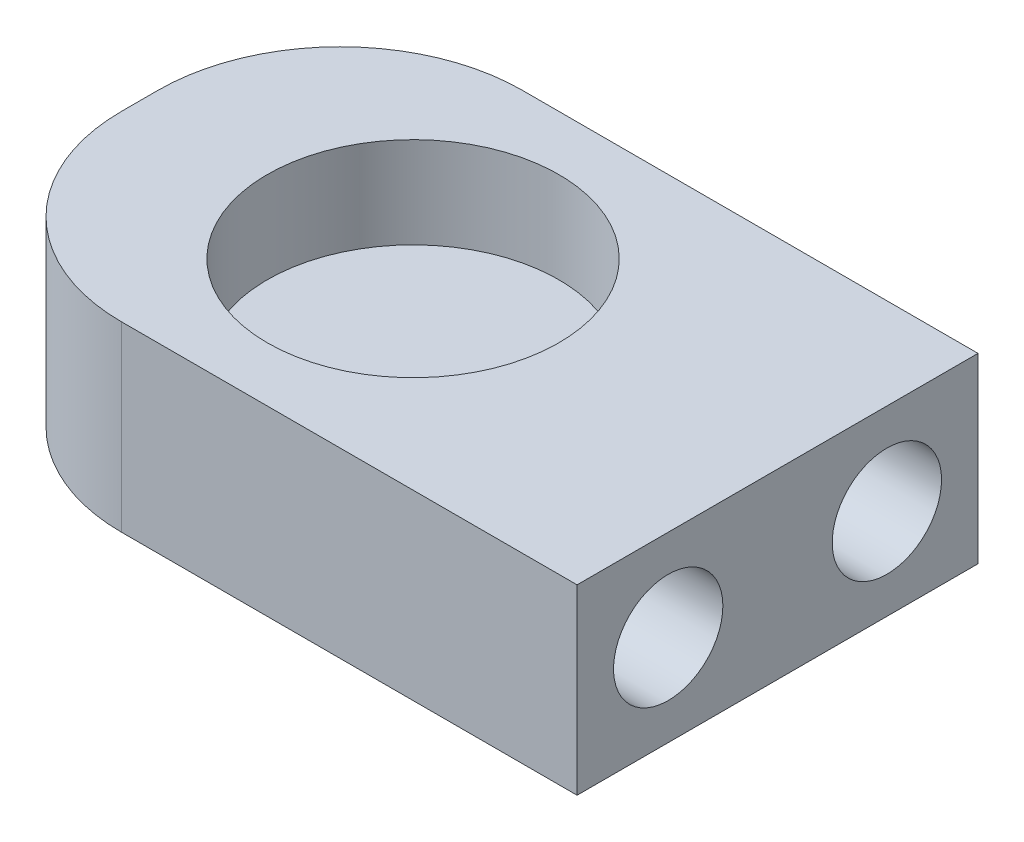
ISO-10303-21;
HEADER;
FILE_DESCRIPTION(('STEP AP214'),'2;1');
FILE_NAME('part.step','',(''),(''),'','','');
FILE_SCHEMA(('AUTOMOTIVE_DESIGN { 1 0 10303 214 1 1 1 1 }'));
ENDSEC;
DATA;
#1=APPLICATION_CONTEXT('core data for automotive mechanical design processes');
#2=APPLICATION_PROTOCOL_DEFINITION('international standard','automotive_design',2000,#1);
#3=PRODUCT_CONTEXT('',#1,'mechanical');
#4=PRODUCT('Part','Part','',(#3));
#5=PRODUCT_RELATED_PRODUCT_CATEGORY('part','',(#4));
#6=PRODUCT_DEFINITION_FORMATION('','',#4);
#7=PRODUCT_DEFINITION_CONTEXT('part definition',#1,'design');
#8=PRODUCT_DEFINITION('design','',#6,#7);
#9=PRODUCT_DEFINITION_SHAPE('','',#8);
#10=(LENGTH_UNIT() NAMED_UNIT(*) SI_UNIT(.MILLI.,.METRE.));
#11=(NAMED_UNIT(*) PLANE_ANGLE_UNIT() SI_UNIT($,.RADIAN.));
#12=(NAMED_UNIT(*) SI_UNIT($,.STERADIAN.) SOLID_ANGLE_UNIT());
#13=UNCERTAINTY_MEASURE_WITH_UNIT(LENGTH_MEASURE(1.E-05),#10,'distance_accuracy_value','');
#14=(GEOMETRIC_REPRESENTATION_CONTEXT(3) GLOBAL_UNCERTAINTY_ASSIGNED_CONTEXT((#13)) GLOBAL_UNIT_ASSIGNED_CONTEXT((#10,
#11,#12)) REPRESENTATION_CONTEXT('',''));
#15=CARTESIAN_POINT('',(0.,0.,0.));
#16=DIRECTION('',(0.,0.,1.));
#17=DIRECTION('',(1.,0.,0.));
#18=AXIS2_PLACEMENT_3D('',#15,#16,#17);
#19=CARTESIAN_POINT('',(17.5,10.,-11.));
#20=DIRECTION('',(-1.,0.,0.));
#21=DIRECTION('',(0.,0.,1.));
#22=AXIS2_PLACEMENT_3D('',#19,#20,#21);
#23=PLANE('',#22);
#24=CARTESIAN_POINT('',(17.5,5.,-6.));
#25=DIRECTION('',(1.,0.,0.));
#26=DIRECTION('',(0.,0.,-1.));
#27=AXIS2_PLACEMENT_3D('',#24,#25,#26);
#28=CIRCLE('',#27,3.);
#29=CARTESIAN_POINT('',(17.5,5.,-9.));
#30=VERTEX_POINT('',#29);
#31=EDGE_CURVE('E234',#30,#30,#28,.T.);
#32=ORIENTED_EDGE('',*,*,#31,.F.);
#33=EDGE_LOOP('',(#32));
#34=FACE_BOUND('',#33,.T.);
#35=CARTESIAN_POINT('',(17.5,5.,6.));
#36=DIRECTION('',(1.,0.,0.));
#37=DIRECTION('',(0.,0.,-1.));
#38=AXIS2_PLACEMENT_3D('',#35,#36,#37);
#39=CIRCLE('',#38,3.);
#40=CARTESIAN_POINT('',(17.5,5.,3.));
#41=VERTEX_POINT('',#40);
#42=EDGE_CURVE('E220',#41,#41,#39,.T.);
#43=ORIENTED_EDGE('',*,*,#42,.F.);
#44=EDGE_LOOP('',(#43));
#45=FACE_BOUND('',#44,.T.);
#46=DIRECTION('',(0.,0.,-1.));
#47=VECTOR('',#46,1.);
#48=CARTESIAN_POINT('',(17.5,0.,-11.));
#49=LINE('',#48,#47);
#50=CARTESIAN_POINT('',(17.5,0.,11.));
#51=VERTEX_POINT('',#50);
#52=CARTESIAN_POINT('',(17.5,0.,-11.));
#53=VERTEX_POINT('',#52);
#54=EDGE_CURVE('E114',#51,#53,#49,.T.);
#55=ORIENTED_EDGE('',*,*,#54,.T.);
#56=DIRECTION('',(0.,-1.,0.));
#57=VECTOR('',#56,1.);
#58=CARTESIAN_POINT('',(17.5,10.,-11.));
#59=LINE('',#58,#57);
#60=CARTESIAN_POINT('',(17.5,10.,-11.));
#61=VERTEX_POINT('',#60);
#62=EDGE_CURVE('E97',#61,#53,#59,.T.);
#63=ORIENTED_EDGE('',*,*,#62,.F.);
#64=DIRECTION('',(0.,0.,-1.));
#65=VECTOR('',#64,1.);
#66=CARTESIAN_POINT('',(17.5,10.,-11.));
#67=LINE('',#66,#65);
#68=CARTESIAN_POINT('',(17.5,10.,11.));
#69=VERTEX_POINT('',#68);
#70=EDGE_CURVE('E102',#69,#61,#67,.T.);
#71=ORIENTED_EDGE('',*,*,#70,.F.);
#72=DIRECTION('',(0.,-1.,0.));
#73=VECTOR('',#72,1.);
#74=CARTESIAN_POINT('',(17.5,10.,11.));
#75=LINE('',#74,#73);
#76=EDGE_CURVE('E117',#69,#51,#75,.T.);
#77=ORIENTED_EDGE('',*,*,#76,.T.);
#78=EDGE_LOOP('',(#55,#63,#71,#77));
#79=FACE_BOUND('',#78,.T.);
#80=ADVANCED_FACE('F39',(#34,#45,#79),#23,.F.);
#81=CARTESIAN_POINT('',(-17.5,10.,-11.));
#82=DIRECTION('',(0.,0.,1.));
#83=DIRECTION('',(1.,0.,0.));
#84=AXIS2_PLACEMENT_3D('',#81,#82,#83);
#85=PLANE('',#84);
#86=DIRECTION('',(-1.,0.,0.));
#87=VECTOR('',#86,1.);
#88=CARTESIAN_POINT('',(-17.5,0.,-11.));
#89=LINE('',#88,#87);
#90=CARTESIAN_POINT('',(-7.5,0.,-11.));
#91=VERTEX_POINT('',#90);
#92=EDGE_CURVE('E152',#53,#91,#89,.T.);
#93=ORIENTED_EDGE('',*,*,#92,.T.);
#94=DIRECTION('',(0.,-1.,0.));
#95=VECTOR('',#94,1.);
#96=CARTESIAN_POINT('',(-7.5,10.,-11.));
#97=LINE('',#96,#95);
#98=CARTESIAN_POINT('',(-7.5,10.,-11.));
#99=VERTEX_POINT('',#98);
#100=EDGE_CURVE('E63',#91,#99,#97,.F.);
#101=ORIENTED_EDGE('',*,*,#100,.T.);
#102=DIRECTION('',(-1.,0.,0.));
#103=VECTOR('',#102,1.);
#104=CARTESIAN_POINT('',(-17.5,10.,-11.));
#105=LINE('',#104,#103);
#106=EDGE_CURVE('E93',#61,#99,#105,.T.);
#107=ORIENTED_EDGE('',*,*,#106,.F.);
#108=ORIENTED_EDGE('',*,*,#62,.T.);
#109=EDGE_LOOP('',(#93,#101,#107,#108));
#110=FACE_BOUND('',#109,.T.);
#111=ADVANCED_FACE('F95',(#110),#85,.F.);
#112=CARTESIAN_POINT('',(-17.5,10.,-11.));
#113=DIRECTION('',(1.,0.,0.));
#114=DIRECTION('',(0.,0.,-1.));
#115=AXIS2_PLACEMENT_3D('',#112,#113,#114);
#116=PLANE('',#115);
#117=DIRECTION('',(0.,0.,1.));
#118=VECTOR('',#117,1.);
#119=CARTESIAN_POINT('',(-17.5,10.,-11.));
#120=LINE('',#119,#118);
#121=CARTESIAN_POINT('',(-17.5,10.,-0.999999999999996));
#122=VERTEX_POINT('',#121);
#123=CARTESIAN_POINT('',(-17.5,10.,1.));
#124=VERTEX_POINT('',#123);
#125=EDGE_CURVE('E101',#122,#124,#120,.T.);
#126=ORIENTED_EDGE('',*,*,#125,.F.);
#127=DIRECTION('',(0.,-1.,0.));
#128=VECTOR('',#127,1.);
#129=CARTESIAN_POINT('',(-17.5,10.,-0.999999999999996));
#130=LINE('',#129,#128);
#131=CARTESIAN_POINT('',(-17.5,0.,-0.999999999999996));
#132=VERTEX_POINT('',#131);
#133=EDGE_CURVE('E121',#122,#132,#130,.T.);
#134=ORIENTED_EDGE('',*,*,#133,.T.);
#135=DIRECTION('',(0.,0.,1.));
#136=VECTOR('',#135,1.);
#137=CARTESIAN_POINT('',(-17.5,0.,-11.));
#138=LINE('',#137,#136);
#139=CARTESIAN_POINT('',(-17.5,0.,1.));
#140=VERTEX_POINT('',#139);
#141=EDGE_CURVE('E153',#132,#140,#138,.T.);
#142=ORIENTED_EDGE('',*,*,#141,.T.);
#143=DIRECTION('',(0.,-1.,0.));
#144=VECTOR('',#143,1.);
#145=CARTESIAN_POINT('',(-17.5,10.,1.));
#146=LINE('',#145,#144);
#147=EDGE_CURVE('E116',#140,#124,#146,.F.);
#148=ORIENTED_EDGE('',*,*,#147,.T.);
#149=EDGE_LOOP('',(#126,#134,#142,#148));
#150=FACE_BOUND('',#149,.T.);
#151=ADVANCED_FACE('F143',(#150),#116,.F.);
#152=CARTESIAN_POINT('',(-17.5,10.,11.));
#153=DIRECTION('',(0.,0.,-1.));
#154=DIRECTION('',(-1.,0.,0.));
#155=AXIS2_PLACEMENT_3D('',#152,#153,#154);
#156=PLANE('',#155);
#157=DIRECTION('',(1.,0.,0.));
#158=VECTOR('',#157,1.);
#159=CARTESIAN_POINT('',(-17.5,10.,11.));
#160=LINE('',#159,#158);
#161=CARTESIAN_POINT('',(-7.5,10.,11.));
#162=VERTEX_POINT('',#161);
#163=EDGE_CURVE('E106',#162,#69,#160,.T.);
#164=ORIENTED_EDGE('',*,*,#163,.F.);
#165=DIRECTION('',(0.,-1.,0.));
#166=VECTOR('',#165,1.);
#167=CARTESIAN_POINT('',(-7.5,10.,11.));
#168=LINE('',#167,#166);
#169=CARTESIAN_POINT('',(-7.5,0.,11.));
#170=VERTEX_POINT('',#169);
#171=EDGE_CURVE('E11',#162,#170,#168,.T.);
#172=ORIENTED_EDGE('',*,*,#171,.T.);
#173=DIRECTION('',(1.,0.,0.));
#174=VECTOR('',#173,1.);
#175=CARTESIAN_POINT('',(-17.5,0.,11.));
#176=LINE('',#175,#174);
#177=EDGE_CURVE('E111',#170,#51,#176,.T.);
#178=ORIENTED_EDGE('',*,*,#177,.T.);
#179=ORIENTED_EDGE('',*,*,#76,.F.);
#180=EDGE_LOOP('',(#164,#172,#178,#179));
#181=FACE_BOUND('',#180,.T.);
#182=ADVANCED_FACE('F165',(#181),#156,.F.);
#183=CARTESIAN_POINT('',(0.,10.,0.));
#184=DIRECTION('',(0.,1.,0.));
#185=DIRECTION('',(0.,0.,1.));
#186=AXIS2_PLACEMENT_3D('',#183,#184,#185);
#187=PLANE('',#186);
#188=CARTESIAN_POINT('',(-2.5,10.,0.));
#189=DIRECTION('',(0.,1.,0.));
#190=DIRECTION('',(0.,0.,1.));
#191=AXIS2_PLACEMENT_3D('',#188,#189,#190);
#192=CIRCLE('',#191,8.);
#193=CARTESIAN_POINT('',(-2.5,10.,8.));
#194=VERTEX_POINT('',#193);
#195=EDGE_CURVE('E221',#194,#194,#192,.T.);
#196=ORIENTED_EDGE('',*,*,#195,.F.);
#197=EDGE_LOOP('',(#196));
#198=FACE_BOUND('',#197,.T.);
#199=ORIENTED_EDGE('',*,*,#106,.T.);
#200=CARTESIAN_POINT('',(-7.5,10.,-0.999999999999997));
#201=DIRECTION('',(0.,1.,0.));
#202=DIRECTION('',(0.,0.,1.));
#203=AXIS2_PLACEMENT_3D('',#200,#201,#202);
#204=CIRCLE('',#203,10.);
#205=EDGE_CURVE('E48',#99,#122,#204,.T.);
#206=ORIENTED_EDGE('',*,*,#205,.T.);
#207=ORIENTED_EDGE('',*,*,#125,.T.);
#208=CARTESIAN_POINT('',(-7.5,10.,1.));
#209=DIRECTION('',(0.,1.,0.));
#210=DIRECTION('',(0.,0.,1.));
#211=AXIS2_PLACEMENT_3D('',#208,#209,#210);
#212=CIRCLE('',#211,10.);
#213=EDGE_CURVE('E55',#124,#162,#212,.T.);
#214=ORIENTED_EDGE('',*,*,#213,.T.);
#215=ORIENTED_EDGE('',*,*,#163,.T.);
#216=ORIENTED_EDGE('',*,*,#70,.T.);
#217=EDGE_LOOP('',(#199,#206,#207,#214,#215,#216));
#218=FACE_BOUND('',#217,.T.);
#219=ADVANCED_FACE('F105',(#198,#218),#187,.T.);
#220=CARTESIAN_POINT('',(0.,0.,0.));
#221=DIRECTION('',(0.,1.,0.));
#222=DIRECTION('',(0.,0.,1.));
#223=AXIS2_PLACEMENT_3D('',#220,#221,#222);
#224=PLANE('',#223);
#225=ORIENTED_EDGE('',*,*,#141,.F.);
#226=CARTESIAN_POINT('',(-7.5,0.,-0.999999999999997));
#227=DIRECTION('',(0.,1.,0.));
#228=DIRECTION('',(0.,0.,1.));
#229=AXIS2_PLACEMENT_3D('',#226,#227,#228);
#230=CIRCLE('',#229,10.);
#231=EDGE_CURVE('E132',#132,#91,#230,.F.);
#232=ORIENTED_EDGE('',*,*,#231,.T.);
#233=ORIENTED_EDGE('',*,*,#92,.F.);
#234=ORIENTED_EDGE('',*,*,#54,.F.);
#235=ORIENTED_EDGE('',*,*,#177,.F.);
#236=CARTESIAN_POINT('',(-7.5,0.,1.));
#237=DIRECTION('',(0.,1.,0.));
#238=DIRECTION('',(0.,0.,1.));
#239=AXIS2_PLACEMENT_3D('',#236,#237,#238);
#240=CIRCLE('',#239,10.);
#241=EDGE_CURVE('E129',#170,#140,#240,.F.);
#242=ORIENTED_EDGE('',*,*,#241,.T.);
#243=EDGE_LOOP('',(#225,#232,#233,#234,#235,#242));
#244=FACE_BOUND('',#243,.T.);
#245=ADVANCED_FACE('F151',(#244),#224,.F.);
#246=CARTESIAN_POINT('',(7.5,5.,6.));
#247=DIRECTION('',(1.,0.,0.));
#248=DIRECTION('',(0.,0.,-1.));
#249=AXIS2_PLACEMENT_3D('',#246,#247,#248);
#250=CYLINDRICAL_SURFACE('',#249,3.);
#251=CARTESIAN_POINT('',(7.5,5.,6.));
#252=DIRECTION('',(1.,0.,0.));
#253=DIRECTION('',(0.,0.,-1.));
#254=AXIS2_PLACEMENT_3D('',#251,#252,#253);
#255=CIRCLE('',#254,3.);
#256=CARTESIAN_POINT('',(7.5,5.,3.));
#257=VERTEX_POINT('',#256);
#258=EDGE_CURVE('E226',#257,#257,#255,.T.);
#259=ORIENTED_EDGE('',*,*,#258,.F.);
#260=EDGE_LOOP('',(#259));
#261=FACE_BOUND('',#260,.T.);
#262=ORIENTED_EDGE('',*,*,#42,.T.);
#263=EDGE_LOOP('',(#262));
#264=FACE_BOUND('',#263,.T.);
#265=ADVANCED_FACE('F189',(#261,#264),#250,.F.);
#266=CARTESIAN_POINT('',(7.5,5.,6.));
#267=DIRECTION('',(1.,0.,0.));
#268=DIRECTION('',(0.,0.,-1.));
#269=AXIS2_PLACEMENT_3D('',#266,#267,#268);
#270=PLANE('',#269);
#271=ORIENTED_EDGE('',*,*,#258,.T.);
#272=EDGE_LOOP('',(#271));
#273=FACE_BOUND('',#272,.T.);
#274=ADVANCED_FACE('F195',(#273),#270,.T.);
#275=CARTESIAN_POINT('',(7.5,5.,-6.));
#276=DIRECTION('',(1.,0.,0.));
#277=DIRECTION('',(0.,0.,-1.));
#278=AXIS2_PLACEMENT_3D('',#275,#276,#277);
#279=CYLINDRICAL_SURFACE('',#278,3.);
#280=CARTESIAN_POINT('',(7.5,5.,-6.));
#281=DIRECTION('',(1.,0.,0.));
#282=DIRECTION('',(0.,0.,-1.));
#283=AXIS2_PLACEMENT_3D('',#280,#281,#282);
#284=CIRCLE('',#283,3.);
#285=CARTESIAN_POINT('',(7.5,5.,-9.));
#286=VERTEX_POINT('',#285);
#287=EDGE_CURVE('E159',#286,#286,#284,.T.);
#288=ORIENTED_EDGE('',*,*,#287,.F.);
#289=EDGE_LOOP('',(#288));
#290=FACE_BOUND('',#289,.T.);
#291=ORIENTED_EDGE('',*,*,#31,.T.);
#292=EDGE_LOOP('',(#291));
#293=FACE_BOUND('',#292,.T.);
#294=ADVANCED_FACE('F199',(#290,#293),#279,.F.);
#295=CARTESIAN_POINT('',(7.5,5.,-6.));
#296=DIRECTION('',(1.,0.,0.));
#297=DIRECTION('',(0.,0.,-1.));
#298=AXIS2_PLACEMENT_3D('',#295,#296,#297);
#299=PLANE('',#298);
#300=ORIENTED_EDGE('',*,*,#287,.T.);
#301=EDGE_LOOP('',(#300));
#302=FACE_BOUND('',#301,.T.);
#303=ADVANCED_FACE('F203',(#302),#299,.T.);
#304=CARTESIAN_POINT('',(-2.5,5.,0.));
#305=DIRECTION('',(0.,1.,0.));
#306=DIRECTION('',(0.,0.,1.));
#307=AXIS2_PLACEMENT_3D('',#304,#305,#306);
#308=CYLINDRICAL_SURFACE('',#307,8.);
#309=CARTESIAN_POINT('',(-2.5,5.,0.));
#310=DIRECTION('',(0.,1.,0.));
#311=DIRECTION('',(0.,0.,1.));
#312=AXIS2_PLACEMENT_3D('',#309,#310,#311);
#313=CIRCLE('',#312,8.);
#314=CARTESIAN_POINT('',(-2.5,5.,8.));
#315=VERTEX_POINT('',#314);
#316=EDGE_CURVE('E218',#315,#315,#313,.T.);
#317=ORIENTED_EDGE('',*,*,#316,.F.);
#318=EDGE_LOOP('',(#317));
#319=FACE_BOUND('',#318,.T.);
#320=ORIENTED_EDGE('',*,*,#195,.T.);
#321=EDGE_LOOP('',(#320));
#322=FACE_BOUND('',#321,.T.);
#323=ADVANCED_FACE('F207',(#319,#322),#308,.F.);
#324=CARTESIAN_POINT('',(-2.5,5.,0.));
#325=DIRECTION('',(0.,1.,0.));
#326=DIRECTION('',(0.,0.,1.));
#327=AXIS2_PLACEMENT_3D('',#324,#325,#326);
#328=PLANE('',#327);
#329=ORIENTED_EDGE('',*,*,#316,.T.);
#330=EDGE_LOOP('',(#329));
#331=FACE_BOUND('',#330,.T.);
#332=ADVANCED_FACE('F172',(#331),#328,.T.);
#333=CARTESIAN_POINT('',(-7.5,10.,-0.999999999999997));
#334=DIRECTION('',(0.,-1.,0.));
#335=DIRECTION('',(0.,0.,-1.));
#336=AXIS2_PLACEMENT_3D('',#333,#334,#335);
#337=CYLINDRICAL_SURFACE('',#336,10.);
#338=ORIENTED_EDGE('',*,*,#205,.F.);
#339=ORIENTED_EDGE('',*,*,#100,.F.);
#340=ORIENTED_EDGE('',*,*,#231,.F.);
#341=ORIENTED_EDGE('',*,*,#133,.F.);
#342=EDGE_LOOP('',(#338,#339,#340,#341));
#343=FACE_BOUND('',#342,.T.);
#344=ADVANCED_FACE('F149',(#343),#337,.T.);
#345=CARTESIAN_POINT('',(-7.5,10.,1.));
#346=DIRECTION('',(0.,-1.,0.));
#347=DIRECTION('',(0.,0.,-1.));
#348=AXIS2_PLACEMENT_3D('',#345,#346,#347);
#349=CYLINDRICAL_SURFACE('',#348,10.);
#350=ORIENTED_EDGE('',*,*,#213,.F.);
#351=ORIENTED_EDGE('',*,*,#147,.F.);
#352=ORIENTED_EDGE('',*,*,#241,.F.);
#353=ORIENTED_EDGE('',*,*,#171,.F.);
#354=EDGE_LOOP('',(#350,#351,#352,#353));
#355=FACE_BOUND('',#354,.T.);
#356=ADVANCED_FACE('F41',(#355),#349,.T.);
#357=CLOSED_SHELL('',(#80,#111,#151,#182,#219,#245,#265,#274,#294,#303,#323,#332,#344,#356));
#358=MANIFOLD_SOLID_BREP('B2',#357);
#359=ADVANCED_BREP_SHAPE_REPRESENTATION('',(#18,#358),#14);
#360=SHAPE_DEFINITION_REPRESENTATION(#9,#359);
ENDSEC;
END-ISO-10303-21;
